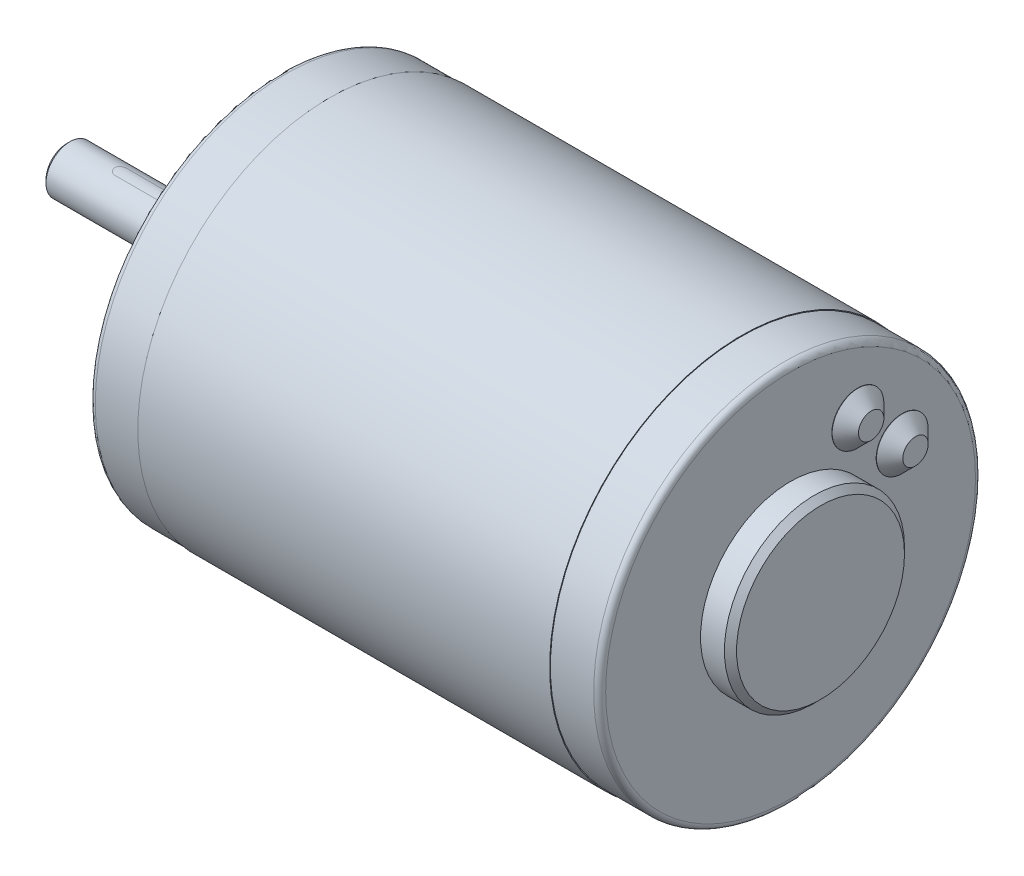
ISO-10303-21;
HEADER;
FILE_DESCRIPTION(('STEP AP214'),'2;1');
FILE_NAME('part.step','',(''),(''),'','','');
FILE_SCHEMA(('AUTOMOTIVE_DESIGN { 1 0 10303 214 1 1 1 1 }'));
ENDSEC;
DATA;
#1=APPLICATION_CONTEXT('core data for automotive mechanical design processes');
#2=APPLICATION_PROTOCOL_DEFINITION('international standard','automotive_design',2000,#1);
#3=PRODUCT_CONTEXT('',#1,'mechanical');
#4=PRODUCT('Part','Part','',(#3));
#5=PRODUCT_RELATED_PRODUCT_CATEGORY('part','',(#4));
#6=PRODUCT_DEFINITION_FORMATION('','',#4);
#7=PRODUCT_DEFINITION_CONTEXT('part definition',#1,'design');
#8=PRODUCT_DEFINITION('design','',#6,#7);
#9=PRODUCT_DEFINITION_SHAPE('','',#8);
#10=(LENGTH_UNIT() NAMED_UNIT(*) SI_UNIT(.MILLI.,.METRE.));
#11=(NAMED_UNIT(*) PLANE_ANGLE_UNIT() SI_UNIT($,.RADIAN.));
#12=(NAMED_UNIT(*) SI_UNIT($,.STERADIAN.) SOLID_ANGLE_UNIT());
#13=UNCERTAINTY_MEASURE_WITH_UNIT(LENGTH_MEASURE(1.E-05),#10,'distance_accuracy_value','');
#14=(GEOMETRIC_REPRESENTATION_CONTEXT(3) GLOBAL_UNCERTAINTY_ASSIGNED_CONTEXT((#13)) GLOBAL_UNIT_ASSIGNED_CONTEXT((#10,
#11,#12)) REPRESENTATION_CONTEXT('',''));
#15=CARTESIAN_POINT('',(0.,0.,0.));
#16=DIRECTION('',(0.,0.,1.));
#17=DIRECTION('',(1.,0.,0.));
#18=AXIS2_PLACEMENT_3D('',#15,#16,#17);
#19=CARTESIAN_POINT('',(-4.,0.,0.));
#20=DIRECTION('',(-1.,0.,0.));
#21=DIRECTION('',(0.,0.,1.));
#22=AXIS2_PLACEMENT_3D('',#19,#20,#21);
#23=PLANE('',#22);
#24=CARTESIAN_POINT('',(-4.,0.,0.));
#25=DIRECTION('',(-1.,0.,0.));
#26=DIRECTION('',(0.,0.,1.));
#27=AXIS2_PLACEMENT_3D('',#24,#25,#26);
#28=CIRCLE('',#27,8.50900000000003);
#29=CARTESIAN_POINT('',(-4.,0.,8.50900000000003));
#30=VERTEX_POINT('',#29);
#31=EDGE_CURVE('P0_E190',#30,#30,#28,.T.);
#32=ORIENTED_EDGE('',*,*,#31,.T.);
#33=EDGE_LOOP('',(#32));
#34=FACE_BOUND('',#33,.T.);
#35=CARTESIAN_POINT('',(-4.,0.,0.));
#36=DIRECTION('',(-1.,0.,0.));
#37=DIRECTION('',(0.,0.,1.));
#38=AXIS2_PLACEMENT_3D('',#35,#36,#37);
#39=CIRCLE('',#38,4.);
#40=CARTESIAN_POINT('',(-4.,0.,4.));
#41=VERTEX_POINT('',#40);
#42=EDGE_CURVE('P0_E122',#41,#41,#39,.T.);
#43=ORIENTED_EDGE('',*,*,#42,.F.);
#44=EDGE_LOOP('',(#43));
#45=FACE_BOUND('',#44,.T.);
#46=ADVANCED_FACE('P0_F39',(#34,#45),#23,.T.);
#47=CARTESIAN_POINT('',(0.,0.,0.));
#48=DIRECTION('',(-1.,0.,0.));
#49=DIRECTION('',(0.,0.,1.));
#50=AXIS2_PLACEMENT_3D('',#47,#48,#49);
#51=PLANE('',#50);
#52=CARTESIAN_POINT('',(0.,0.,0.));
#53=DIRECTION('',(-1.,0.,0.));
#54=DIRECTION('',(0.,0.,1.));
#55=AXIS2_PLACEMENT_3D('',#52,#53,#54);
#56=CIRCLE('',#55,30.877);
#57=CARTESIAN_POINT('',(0.,0.,30.877));
#58=VERTEX_POINT('',#57);
#59=EDGE_CURVE('P0_E208',#58,#58,#56,.T.);
#60=ORIENTED_EDGE('',*,*,#59,.T.);
#61=EDGE_LOOP('',(#60));
#62=FACE_BOUND('',#61,.T.);
#63=CARTESIAN_POINT('',(0.,25.4,0.));
#64=DIRECTION('',(-1.,0.,0.));
#65=DIRECTION('',(0.,0.,1.));
#66=AXIS2_PLACEMENT_3D('',#63,#64,#65);
#67=CIRCLE('',#66,2.01929999999999);
#68=CARTESIAN_POINT('',(0.,25.4,2.01929999999999));
#69=VERTEX_POINT('',#68);
#70=EDGE_CURVE('P0_E96',#69,#69,#67,.T.);
#71=ORIENTED_EDGE('',*,*,#70,.F.);
#72=EDGE_LOOP('',(#71));
#73=FACE_BOUND('',#72,.T.);
#74=CARTESIAN_POINT('',(0.,-25.4,0.));
#75=DIRECTION('',(-1.,0.,0.));
#76=DIRECTION('',(0.,0.,1.));
#77=AXIS2_PLACEMENT_3D('',#74,#75,#76);
#78=CIRCLE('',#77,2.01929999999999);
#79=CARTESIAN_POINT('',(0.,-25.4,2.01929999999999));
#80=VERTEX_POINT('',#79);
#81=EDGE_CURVE('P0_E95',#80,#80,#78,.T.);
#82=ORIENTED_EDGE('',*,*,#81,.F.);
#83=EDGE_LOOP('',(#82));
#84=FACE_BOUND('',#83,.T.);
#85=CARTESIAN_POINT('',(0.,0.,0.));
#86=DIRECTION('',(-1.,0.,0.));
#87=DIRECTION('',(0.,0.,1.));
#88=AXIS2_PLACEMENT_3D('',#85,#86,#87);
#89=CIRCLE('',#88,9.525);
#90=CARTESIAN_POINT('',(0.,0.,9.525));
#91=VERTEX_POINT('',#90);
#92=EDGE_CURVE('P0_E166',#91,#91,#89,.T.);
#93=ORIENTED_EDGE('',*,*,#92,.F.);
#94=EDGE_LOOP('',(#93));
#95=FACE_BOUND('',#94,.T.);
#96=ADVANCED_FACE('P0_F229',(#62,#73,#84,#95),#51,.T.);
#97=CARTESIAN_POINT('',(8.2296,32.004,0.));
#98=DIRECTION('',(-1.,0.,0.));
#99=DIRECTION('',(0.,0.,1.));
#100=AXIS2_PLACEMENT_3D('',#97,#98,#99);
#101=PLANE('',#100);
#102=CARTESIAN_POINT('',(8.2296,0.,0.));
#103=DIRECTION('',(1.,0.,0.));
#104=DIRECTION('',(0.,0.,-1.));
#105=AXIS2_PLACEMENT_3D('',#102,#103,#104);
#106=CIRCLE('',#105,32.004);
#107=CARTESIAN_POINT('',(8.2296,0.,-32.004));
#108=VERTEX_POINT('',#107);
#109=EDGE_CURVE('P0_E181',#108,#108,#106,.T.);
#110=ORIENTED_EDGE('',*,*,#109,.F.);
#111=EDGE_LOOP('',(#110));
#112=FACE_BOUND('',#111,.T.);
#113=CARTESIAN_POINT('',(8.2296,0.,0.));
#114=DIRECTION('',(-1.,0.,0.));
#115=DIRECTION('',(0.,0.,1.));
#116=AXIS2_PLACEMENT_3D('',#113,#114,#115);
#117=CIRCLE('',#116,31.877);
#118=CARTESIAN_POINT('',(8.2296,0.,31.877));
#119=VERTEX_POINT('',#118);
#120=EDGE_CURVE('P0_E169',#119,#119,#117,.T.);
#121=ORIENTED_EDGE('',*,*,#120,.F.);
#122=EDGE_LOOP('',(#121));
#123=FACE_BOUND('',#122,.T.);
#124=ADVANCED_FACE('P0_F235',(#112,#123),#101,.T.);
#125=CARTESIAN_POINT('',(85.216,0.,0.));
#126=DIRECTION('',(1.,0.,0.));
#127=DIRECTION('',(0.,0.,-1.));
#128=AXIS2_PLACEMENT_3D('',#125,#126,#127);
#129=PLANE('',#128);
#130=CARTESIAN_POINT('',(85.216,0.,0.));
#131=DIRECTION('',(1.,0.,0.));
#132=DIRECTION('',(0.,0.,-1.));
#133=AXIS2_PLACEMENT_3D('',#130,#131,#132);
#134=CIRCLE('',#133,30.877);
#135=CARTESIAN_POINT('',(85.216,0.,-30.877));
#136=VERTEX_POINT('',#135);
#137=EDGE_CURVE('P0_E47',#136,#136,#134,.T.);
#138=ORIENTED_EDGE('',*,*,#137,.T.);
#139=EDGE_LOOP('',(#138));
#140=FACE_BOUND('',#139,.T.);
#141=CARTESIAN_POINT('',(85.216,18.6070906828553,-11.2073596390943));
#142=DIRECTION('',(1.,0.,0.));
#143=DIRECTION('',(0.,0.,-1.));
#144=AXIS2_PLACEMENT_3D('',#141,#142,#143);
#145=CIRCLE('',#144,4.318);
#146=CARTESIAN_POINT('',(85.216,18.6070906828553,-15.5253596390943));
#147=VERTEX_POINT('',#146);
#148=EDGE_CURVE('P0_E187',#147,#147,#145,.T.);
#149=ORIENTED_EDGE('',*,*,#148,.F.);
#150=EDGE_LOOP('',(#149));
#151=FACE_BOUND('',#150,.T.);
#152=CARTESIAN_POINT('',(85.216,11.2073596390943,-18.6070906828553));
#153=DIRECTION('',(1.,0.,0.));
#154=DIRECTION('',(0.,0.,-1.));
#155=AXIS2_PLACEMENT_3D('',#152,#153,#154);
#156=CIRCLE('',#155,4.318);
#157=CARTESIAN_POINT('',(85.216,11.2073596390943,-22.9250906828553));
#158=VERTEX_POINT('',#157);
#159=EDGE_CURVE('P0_E184',#158,#158,#156,.T.);
#160=ORIENTED_EDGE('',*,*,#159,.F.);
#161=EDGE_LOOP('',(#160));
#162=FACE_BOUND('',#161,.T.);
#163=CARTESIAN_POINT('',(85.216,0.,0.));
#164=DIRECTION('',(1.,0.,0.));
#165=DIRECTION('',(0.,0.,-1.));
#166=AXIS2_PLACEMENT_3D('',#163,#164,#165);
#167=CIRCLE('',#166,15.0368);
#168=CARTESIAN_POINT('',(85.216,0.,-15.0368));
#169=VERTEX_POINT('',#168);
#170=EDGE_CURVE('P0_E172',#169,#169,#167,.T.);
#171=ORIENTED_EDGE('',*,*,#170,.F.);
#172=EDGE_LOOP('',(#171));
#173=FACE_BOUND('',#172,.T.);
#174=ADVANCED_FACE('P0_F216',(#140,#151,#162,#173),#129,.T.);
#175=CARTESIAN_POINT('',(76.9864,0.,0.));
#176=DIRECTION('',(1.,0.,0.));
#177=DIRECTION('',(0.,0.,-1.));
#178=AXIS2_PLACEMENT_3D('',#175,#176,#177);
#179=PLANE('',#178);
#180=CARTESIAN_POINT('',(76.9864,0.,0.));
#181=DIRECTION('',(1.,0.,0.));
#182=DIRECTION('',(0.,0.,-1.));
#183=AXIS2_PLACEMENT_3D('',#180,#181,#182);
#184=CIRCLE('',#183,32.004);
#185=CARTESIAN_POINT('',(76.9864,0.,-32.004));
#186=VERTEX_POINT('',#185);
#187=EDGE_CURVE('P0_E178',#186,#186,#184,.T.);
#188=ORIENTED_EDGE('',*,*,#187,.T.);
#189=EDGE_LOOP('',(#188));
#190=FACE_BOUND('',#189,.T.);
#191=CARTESIAN_POINT('',(76.9864,0.,0.));
#192=DIRECTION('',(1.,0.,0.));
#193=DIRECTION('',(0.,0.,-1.));
#194=AXIS2_PLACEMENT_3D('',#191,#192,#193);
#195=CIRCLE('',#194,31.877);
#196=CARTESIAN_POINT('',(76.9864,0.,-31.877));
#197=VERTEX_POINT('',#196);
#198=EDGE_CURVE('P0_E175',#197,#197,#195,.T.);
#199=ORIENTED_EDGE('',*,*,#198,.F.);
#200=EDGE_LOOP('',(#199));
#201=FACE_BOUND('',#200,.T.);
#202=ADVANCED_FACE('P0_F262',(#190,#201),#179,.T.);
#203=CARTESIAN_POINT('',(8.2296,0.,0.));
#204=DIRECTION('',(1.,0.,0.));
#205=DIRECTION('',(0.,0.,-1.));
#206=AXIS2_PLACEMENT_3D('',#203,#204,#205);
#207=CYLINDRICAL_SURFACE('',#206,32.004);
#208=ORIENTED_EDGE('',*,*,#109,.T.);
#209=EDGE_LOOP('',(#208));
#210=FACE_BOUND('',#209,.T.);
#211=ORIENTED_EDGE('',*,*,#187,.F.);
#212=EDGE_LOOP('',(#211));
#213=FACE_BOUND('',#212,.T.);
#214=ADVANCED_FACE('P0_F265',(#210,#213),#207,.T.);
#215=CARTESIAN_POINT('',(85.216,0.,0.));
#216=DIRECTION('',(-1.,0.,0.));
#217=DIRECTION('',(0.,0.,1.));
#218=AXIS2_PLACEMENT_3D('',#215,#216,#217);
#219=CYLINDRICAL_SURFACE('',#218,31.877);
#220=CARTESIAN_POINT('',(84.216,0.,0.));
#221=DIRECTION('',(1.,0.,0.));
#222=DIRECTION('',(0.,0.,-1.));
#223=AXIS2_PLACEMENT_3D('',#220,#221,#222);
#224=CIRCLE('',#223,31.877);
#225=CARTESIAN_POINT('',(84.216,0.,-31.877));
#226=VERTEX_POINT('',#225);
#227=EDGE_CURVE('P0_E11',#226,#226,#224,.F.);
#228=ORIENTED_EDGE('',*,*,#227,.T.);
#229=EDGE_LOOP('',(#228));
#230=FACE_BOUND('',#229,.T.);
#231=ORIENTED_EDGE('',*,*,#198,.T.);
#232=EDGE_LOOP('',(#231));
#233=FACE_BOUND('',#232,.T.);
#234=ADVANCED_FACE('P0_F258',(#230,#233),#219,.T.);
#235=CARTESIAN_POINT('',(90.216,0.,0.));
#236=DIRECTION('',(-1.,0.,0.));
#237=DIRECTION('',(0.,0.,1.));
#238=AXIS2_PLACEMENT_3D('',#235,#236,#237);
#239=CYLINDRICAL_SURFACE('',#238,15.0368);
#240=CARTESIAN_POINT('',(89.2,0.,0.));
#241=DIRECTION('',(1.,0.,0.));
#242=DIRECTION('',(0.,0.,-1.));
#243=AXIS2_PLACEMENT_3D('',#240,#241,#242);
#244=CIRCLE('',#243,15.0368);
#245=CARTESIAN_POINT('',(89.2,0.,-15.0368));
#246=VERTEX_POINT('',#245);
#247=EDGE_CURVE('P0_E199',#246,#246,#244,.F.);
#248=ORIENTED_EDGE('',*,*,#247,.T.);
#249=EDGE_LOOP('',(#248));
#250=FACE_BOUND('',#249,.T.);
#251=ORIENTED_EDGE('',*,*,#170,.T.);
#252=EDGE_LOOP('',(#251));
#253=FACE_BOUND('',#252,.T.);
#254=ADVANCED_FACE('P0_F254',(#250,#253),#239,.T.);
#255=CARTESIAN_POINT('',(90.216,0.,0.));
#256=DIRECTION('',(1.,0.,0.));
#257=DIRECTION('',(0.,0.,-1.));
#258=AXIS2_PLACEMENT_3D('',#255,#256,#257);
#259=PLANE('',#258);
#260=CARTESIAN_POINT('',(90.216,0.,0.));
#261=DIRECTION('',(1.,0.,0.));
#262=DIRECTION('',(0.,0.,-1.));
#263=AXIS2_PLACEMENT_3D('',#260,#261,#262);
#264=CIRCLE('',#263,14.0208);
#265=CARTESIAN_POINT('',(90.216,0.,-14.0208));
#266=VERTEX_POINT('',#265);
#267=EDGE_CURVE('P0_E196',#266,#266,#264,.T.);
#268=ORIENTED_EDGE('',*,*,#267,.T.);
#269=EDGE_LOOP('',(#268));
#270=FACE_BOUND('',#269,.T.);
#271=ADVANCED_FACE('P0_F250',(#270),#259,.T.);
#272=CARTESIAN_POINT('',(0.,0.,0.));
#273=DIRECTION('',(1.,0.,0.));
#274=DIRECTION('',(0.,0.,-1.));
#275=AXIS2_PLACEMENT_3D('',#272,#273,#274);
#276=CYLINDRICAL_SURFACE('',#275,31.877);
#277=CARTESIAN_POINT('',(0.999999999999997,0.,0.));
#278=DIRECTION('',(-1.,0.,0.));
#279=DIRECTION('',(0.,0.,1.));
#280=AXIS2_PLACEMENT_3D('',#277,#278,#279);
#281=CIRCLE('',#280,31.877);
#282=CARTESIAN_POINT('',(0.999999999999997,0.,31.877));
#283=VERTEX_POINT('',#282);
#284=EDGE_CURVE('P0_E211',#283,#283,#281,.F.);
#285=ORIENTED_EDGE('',*,*,#284,.T.);
#286=EDGE_LOOP('',(#285));
#287=FACE_BOUND('',#286,.T.);
#288=ORIENTED_EDGE('',*,*,#120,.T.);
#289=EDGE_LOOP('',(#288));
#290=FACE_BOUND('',#289,.T.);
#291=ADVANCED_FACE('P0_F245',(#287,#290),#276,.T.);
#292=CARTESIAN_POINT('',(-4.,0.,0.));
#293=DIRECTION('',(1.,0.,0.));
#294=DIRECTION('',(0.,0.,-1.));
#295=AXIS2_PLACEMENT_3D('',#292,#293,#294);
#296=CYLINDRICAL_SURFACE('',#295,9.525);
#297=CARTESIAN_POINT('',(-2.98400000000003,0.,0.));
#298=DIRECTION('',(-1.,0.,0.));
#299=DIRECTION('',(0.,0.,1.));
#300=AXIS2_PLACEMENT_3D('',#297,#298,#299);
#301=CIRCLE('',#300,9.525);
#302=CARTESIAN_POINT('',(-2.98400000000003,0.,9.525));
#303=VERTEX_POINT('',#302);
#304=EDGE_CURVE('P0_E193',#303,#303,#301,.F.);
#305=ORIENTED_EDGE('',*,*,#304,.T.);
#306=EDGE_LOOP('',(#305));
#307=FACE_BOUND('',#306,.T.);
#308=ORIENTED_EDGE('',*,*,#92,.T.);
#309=EDGE_LOOP('',(#308));
#310=FACE_BOUND('',#309,.T.);
#311=ADVANCED_FACE('P0_F243',(#307,#310),#296,.T.);
#312=CARTESIAN_POINT('',(-35.6,0.,0.));
#313=DIRECTION('',(1.,0.,0.));
#314=DIRECTION('',(0.,0.,-1.));
#315=AXIS2_PLACEMENT_3D('',#312,#313,#314);
#316=CYLINDRICAL_SURFACE('',#315,4.);
#317=CARTESIAN_POINT('',(-35.0999999999929,0.,0.));
#318=DIRECTION('',(-1.,0.,0.));
#319=DIRECTION('',(0.,0.,1.));
#320=AXIS2_PLACEMENT_3D('',#317,#318,#319);
#321=CIRCLE('',#320,4.);
#322=CARTESIAN_POINT('',(-35.0999999999929,0.,4.));
#323=VERTEX_POINT('',#322);
#324=EDGE_CURVE('P0_E205',#323,#323,#321,.F.);
#325=ORIENTED_EDGE('',*,*,#324,.T.);
#326=EDGE_LOOP('',(#325));
#327=FACE_BOUND('',#326,.T.);
#328=DIRECTION('',(1.,0.,0.));
#329=VECTOR('',#328,1.);
#330=CARTESIAN_POINT('',(0.,3.87298334620741,-1.));
#331=LINE('',#330,#329);
#332=CARTESIAN_POINT('',(-26.6,3.87298334620741,-1.));
#333=VERTEX_POINT('',#332);
#334=CARTESIAN_POINT('',(-7.1,3.87298334620741,-1.));
#335=VERTEX_POINT('',#334);
#336=EDGE_CURVE('P0_E141',#333,#335,#331,.T.);
#337=ORIENTED_EDGE('',*,*,#336,.T.);
#338=CARTESIAN_POINT('',(-7.1,3.87298334620741,-1.));
#339=CARTESIAN_POINT('',(-7.07233701489346,3.87298148580177,-1.00000033749611));
#340=CARTESIAN_POINT('',(-7.04468773698177,3.8732800994947,-0.998851407375366));
#341=CARTESIAN_POINT('',(-6.98959596469644,3.87445904774558,-0.994271295395754));
#342=CARTESIAN_POINT('',(-6.96215343631291,3.87533928441687,-0.990840497572679));
#343=CARTESIAN_POINT('',(-6.88054682679116,3.87881710972053,-0.977175239382526));
#344=CARTESIAN_POINT('',(-6.82694353151779,3.88225203148808,-0.963567695172493));
#345=CARTESIAN_POINT('',(-6.72287532621804,3.89095422588002,-0.927798076247997));
#346=CARTESIAN_POINT('',(-6.67241012178714,3.89622132630929,-0.905636805423836));
#347=CARTESIAN_POINT('',(-6.57588855135267,3.90799134471939,-0.853415378025865));
#348=CARTESIAN_POINT('',(-6.52983337210904,3.91449459395647,-0.823353103356933));
#349=CARTESIAN_POINT('',(-6.4424561180939,3.92816262398025,-0.755484471828069));
#350=CARTESIAN_POINT('',(-6.40124511375448,3.93533791028915,-0.717537268783976));
#351=CARTESIAN_POINT('',(-6.32569791051729,3.94945104396193,-0.63527578051623));
#352=CARTESIAN_POINT('',(-6.29136281053206,3.95638885322537,-0.590960479478831));
#353=CARTESIAN_POINT('',(-6.23008899838136,3.96936182283248,-0.496456899401691));
#354=CARTESIAN_POINT('',(-6.20326010401603,3.9753830468173,-0.446195340334474));
#355=CARTESIAN_POINT('',(-6.1584752658033,3.98572346250588,-0.341702590842919));
#356=CARTESIAN_POINT('',(-6.14051757570017,3.990042989147,-0.28747218408301));
#357=CARTESIAN_POINT('',(-6.11434100722257,3.99641900005128,-0.17774410852516));
#358=CARTESIAN_POINT('',(-6.10593232757718,3.998519529013,-0.122294322002858));
#359=CARTESIAN_POINT('',(-6.09849662845671,4.00037438150815,-0.0107327756816796));
#360=CARTESIAN_POINT('',(-6.09946842980766,4.00012899993444,0.0453789000287057));
#361=CARTESIAN_POINT('',(-6.11062996368545,3.99735237365735,0.155352492972096));
#362=CARTESIAN_POINT('',(-6.12061461659948,3.9948719867736,0.209236701739855));
#363=CARTESIAN_POINT('',(-6.14918867918275,3.98796330636495,0.31453871108434));
#364=CARTESIAN_POINT('',(-6.16777846956858,3.98353492665556,0.365956402423988));
#365=CARTESIAN_POINT('',(-6.21320128067065,3.97314997761798,0.465407286024539));
#366=CARTESIAN_POINT('',(-6.24010739423284,3.96717993827555,0.513405629602248));
#367=CARTESIAN_POINT('',(-6.30134312983347,3.95435945541919,0.604276631230014));
#368=CARTESIAN_POINT('',(-6.33567387025322,3.94750887933198,0.647148515562289));
#369=CARTESIAN_POINT('',(-6.41187891208131,3.93345566022865,0.72776938970849));
#370=CARTESIAN_POINT('',(-6.45393163653981,3.92624850477685,0.765349103054127));
#371=CARTESIAN_POINT('',(-6.54382986692773,3.91246168284006,0.832969575186237));
#372=CARTESIAN_POINT('',(-6.59167695328356,3.90588218842993,0.863008270245062));
#373=CARTESIAN_POINT('',(-6.69214559782377,3.89407813586325,0.914804709285962));
#374=CARTESIAN_POINT('',(-6.74479146489609,3.88886106009136,0.936517017887269));
#375=CARTESIAN_POINT('',(-6.85311692841829,3.88047058807055,0.970702351849829));
#376=CARTESIAN_POINT('',(-6.90879185514984,3.87729413761435,0.983189189212132));
#377=CARTESIAN_POINT('',(-6.9874573807589,3.87455290681524,0.993904635150938));
#378=CARTESIAN_POINT('',(-7.00991970321318,3.87396523110859,0.996190790966708));
#379=CARTESIAN_POINT('',(-7.05491778990932,3.87318062488974,0.999236757697394));
#380=CARTESIAN_POINT('',(-7.07745337595529,3.87298306219461,0.999999038096045));
#381=CARTESIAN_POINT('',(-7.1,3.87298334620741,1.));
#382=B_SPLINE_CURVE_WITH_KNOTS('',3,(#338,#339,#340,#341,#342,#343,#344,#345,#346,#347,#348,
#349,#350,#351,#352,#353,#354,#355,#356,#357,#358,#359,#360,#361,#362,#363,#364,#365,#366,#367,
#368,#369,#370,#371,#372,#373,#374,#375,#376,#377,#378,#379,#380,#381),.UNSPECIFIED.,.F.,.F.,(4,
2,2,2,2,2,2,2,2,2,2,2,2,2,2,2,2,2,2,2,2,4),(0.,0.0829365303397693,0.165859106084651,
0.331229963080317,0.496585282091498,0.661984974726749,0.830641897427974,0.999325753539193,
1.17036187098235,1.34136430732424,1.50890481515325,1.67642426256639,1.84022545479276,
2.00403389475838,2.16932509450376,2.33464120964329,2.50441429534542,2.67423379180967,
2.84496720161068,3.01544447539986,3.08315848722648,3.15076267731671),.UNSPECIFIED.);
#383=CARTESIAN_POINT('',(-7.1,3.87298334620741,1.));
#384=VERTEX_POINT('',#383);
#385=EDGE_CURVE('P0_E118',#335,#384,#382,.T.);
#386=ORIENTED_EDGE('',*,*,#385,.T.);
#387=DIRECTION('',(1.,0.,0.));
#388=VECTOR('',#387,1.);
#389=CARTESIAN_POINT('',(0.,3.87298334620741,1.));
#390=LINE('',#389,#388);
#391=CARTESIAN_POINT('',(-26.6,3.87298334620741,1.));
#392=VERTEX_POINT('',#391);
#393=EDGE_CURVE('P0_E156',#384,#392,#390,.F.);
#394=ORIENTED_EDGE('',*,*,#393,.T.);
#395=CARTESIAN_POINT('',(-26.6,3.87298334620741,1.));
#396=CARTESIAN_POINT('',(-26.6276629851065,3.87298148580177,1.00000033749611));
#397=CARTESIAN_POINT('',(-26.6553122630182,3.8732800994947,0.998851407375366));
#398=CARTESIAN_POINT('',(-26.7104040353036,3.87445904774558,0.994271295395754));
#399=CARTESIAN_POINT('',(-26.7378465636871,3.87533928441687,0.990840497572679));
#400=CARTESIAN_POINT('',(-26.8194531732088,3.87881710972053,0.977175239382526));
#401=CARTESIAN_POINT('',(-26.8730564684822,3.88225203148808,0.963567695172493));
#402=CARTESIAN_POINT('',(-26.977124673782,3.89095422588002,0.927798076247996));
#403=CARTESIAN_POINT('',(-27.0275898782129,3.89622132630929,0.905636805423835));
#404=CARTESIAN_POINT('',(-27.1241114486473,3.90799134471939,0.853415378025864));
#405=CARTESIAN_POINT('',(-27.170166627891,3.91449459395647,0.823353103356932));
#406=CARTESIAN_POINT('',(-27.2575438819061,3.92816262398025,0.755484471828069));
#407=CARTESIAN_POINT('',(-27.2987548862455,3.93533791028915,0.717537268783975));
#408=CARTESIAN_POINT('',(-27.3743020894827,3.94945104396193,0.635275780516229));
#409=CARTESIAN_POINT('',(-27.4086371894679,3.95638885322537,0.59096047947883));
#410=CARTESIAN_POINT('',(-27.4699110016186,3.96936182283248,0.496456899401689));
#411=CARTESIAN_POINT('',(-27.496739895984,3.9753830468173,0.446195340334472));
#412=CARTESIAN_POINT('',(-27.5415247341967,3.98572346250588,0.341702590842916));
#413=CARTESIAN_POINT('',(-27.5594824242998,3.990042989147,0.287472184083007));
#414=CARTESIAN_POINT('',(-27.5856589927774,3.99641900005128,0.177744108525158));
#415=CARTESIAN_POINT('',(-27.5940676724228,3.998519529013,0.122294322002856));
#416=CARTESIAN_POINT('',(-27.6015033715433,4.00037438150815,0.0107327756816781));
#417=CARTESIAN_POINT('',(-27.6005315701923,4.00012899993444,-0.0453789000287067));
#418=CARTESIAN_POINT('',(-27.5893700363146,3.99735237365735,-0.155352492972096));
#419=CARTESIAN_POINT('',(-27.5793853834005,3.9948719867736,-0.209236701739855));
#420=CARTESIAN_POINT('',(-27.5508113208173,3.98796330636495,-0.31453871108434));
#421=CARTESIAN_POINT('',(-27.5322215304314,3.98353492665556,-0.365956402423988));
#422=CARTESIAN_POINT('',(-27.4867987193294,3.97314997761798,-0.46540728602454));
#423=CARTESIAN_POINT('',(-27.4598926057672,3.96717993827555,-0.513405629602248));
#424=CARTESIAN_POINT('',(-27.3986568701665,3.95435945541919,-0.604276631230015));
#425=CARTESIAN_POINT('',(-27.3643261297468,3.94750887933198,-0.64714851556229));
#426=CARTESIAN_POINT('',(-27.2881210879187,3.93345566022865,-0.727769389708492));
#427=CARTESIAN_POINT('',(-27.2460683634602,3.92624850477685,-0.765349103054128));
#428=CARTESIAN_POINT('',(-27.1561701330723,3.91246168284006,-0.832969575186237));
#429=CARTESIAN_POINT('',(-27.1083230467164,3.90588218842993,-0.863008270245062));
#430=CARTESIAN_POINT('',(-27.0078544021762,3.89407813586325,-0.914804709285961));
#431=CARTESIAN_POINT('',(-26.9552085351039,3.88886106009136,-0.936517017887269));
#432=CARTESIAN_POINT('',(-26.8468830715817,3.88047058807054,-0.970702351849828));
#433=CARTESIAN_POINT('',(-26.7912081448502,3.87729413761435,-0.983189189212131));
#434=CARTESIAN_POINT('',(-26.7125426192411,3.87455290681524,-0.993904635150938));
#435=CARTESIAN_POINT('',(-26.6900802967868,3.87396523110859,-0.996190790966708));
#436=CARTESIAN_POINT('',(-26.6450822100907,3.87318062488974,-0.999236757697394));
#437=CARTESIAN_POINT('',(-26.6225466240447,3.87298306219461,-0.999999038096045));
#438=CARTESIAN_POINT('',(-26.6,3.87298334620741,-1.));
#439=B_SPLINE_CURVE_WITH_KNOTS('',3,(#395,#396,#397,#398,#399,#400,#401,#402,#403,#404,#405,
#406,#407,#408,#409,#410,#411,#412,#413,#414,#415,#416,#417,#418,#419,#420,#421,#422,#423,#424,
#425,#426,#427,#428,#429,#430,#431,#432,#433,#434,#435,#436,#437,#438),.UNSPECIFIED.,.F.,.F.,(4,
2,2,2,2,2,2,2,2,2,2,2,2,2,2,2,2,2,2,2,2,4),(0.,0.0829365303397727,0.165859106084653,
0.331229963080318,0.496585282091499,0.661984974726751,0.830641897427976,0.999325753539196,
1.17036187098235,1.34136430732425,1.50890481515325,1.67642426256639,1.84022545479276,
2.00403389475838,2.16932509450376,2.33464120964329,2.50441429534542,2.67423379180967,
2.84496720161068,3.01544447539986,3.08315848722649,3.15076267731671),.UNSPECIFIED.);
#440=EDGE_CURVE('P0_E54',#392,#333,#439,.T.);
#441=ORIENTED_EDGE('',*,*,#440,.T.);
#442=EDGE_LOOP('',(#337,#386,#394,#441));
#443=FACE_BOUND('',#442,.T.);
#444=ORIENTED_EDGE('',*,*,#42,.T.);
#445=EDGE_LOOP('',(#444));
#446=FACE_BOUND('',#445,.T.);
#447=ADVANCED_FACE('P0_F241',(#327,#443,#446),#316,.T.);
#448=CARTESIAN_POINT('',(-35.6,0.,0.));
#449=DIRECTION('',(-1.,0.,0.));
#450=DIRECTION('',(0.,0.,1.));
#451=AXIS2_PLACEMENT_3D('',#448,#449,#450);
#452=PLANE('',#451);
#453=CARTESIAN_POINT('',(-35.6,0.,0.));
#454=DIRECTION('',(-1.,0.,0.));
#455=DIRECTION('',(0.,0.,1.));
#456=AXIS2_PLACEMENT_3D('',#453,#454,#455);
#457=CIRCLE('',#456,3.4999999999361);
#458=CARTESIAN_POINT('',(-35.6,0.,3.4999999999361));
#459=VERTEX_POINT('',#458);
#460=EDGE_CURVE('P0_E202',#459,#459,#457,.T.);
#461=ORIENTED_EDGE('',*,*,#460,.T.);
#462=EDGE_LOOP('',(#461));
#463=FACE_BOUND('',#462,.T.);
#464=ADVANCED_FACE('P0_F292',(#463),#452,.T.);
#465=CARTESIAN_POINT('',(-7.1,32.005,0.));
#466=DIRECTION('',(0.,-1.,0.));
#467=DIRECTION('',(0.,0.,-1.));
#468=AXIS2_PLACEMENT_3D('',#465,#466,#467);
#469=CYLINDRICAL_SURFACE('',#468,1.);
#470=ORIENTED_EDGE('',*,*,#385,.F.);
#471=DIRECTION('',(0.,-1.,0.));
#472=VECTOR('',#471,1.);
#473=CARTESIAN_POINT('',(-7.1,32.005,-1.));
#474=LINE('',#473,#472);
#475=CARTESIAN_POINT('',(-7.1,2.79999999999999,-1.));
#476=VERTEX_POINT('',#475);
#477=EDGE_CURVE('P0_E140',#335,#476,#474,.T.);
#478=ORIENTED_EDGE('',*,*,#477,.T.);
#479=CARTESIAN_POINT('',(-7.1,2.79999999999999,0.));
#480=DIRECTION('',(0.,-1.,0.));
#481=DIRECTION('',(0.,0.,-1.));
#482=AXIS2_PLACEMENT_3D('',#479,#480,#481);
#483=CIRCLE('',#482,1.);
#484=CARTESIAN_POINT('',(-7.1,2.79999999999999,1.));
#485=VERTEX_POINT('',#484);
#486=EDGE_CURVE('P0_E129',#476,#485,#483,.T.);
#487=ORIENTED_EDGE('',*,*,#486,.T.);
#488=DIRECTION('',(0.,-1.,0.));
#489=VECTOR('',#488,1.);
#490=CARTESIAN_POINT('',(-7.1,32.005,1.));
#491=LINE('',#490,#489);
#492=EDGE_CURVE('P0_E62',#384,#485,#491,.T.);
#493=ORIENTED_EDGE('',*,*,#492,.F.);
#494=EDGE_LOOP('',(#470,#478,#487,#493));
#495=FACE_BOUND('',#494,.T.);
#496=ADVANCED_FACE('P0_F294',(#495),#469,.F.);
#497=CARTESIAN_POINT('',(-26.6,32.005,-1.));
#498=DIRECTION('',(0.,0.,-1.));
#499=DIRECTION('',(-1.,0.,0.));
#500=AXIS2_PLACEMENT_3D('',#497,#498,#499);
#501=PLANE('',#500);
#502=ORIENTED_EDGE('',*,*,#336,.F.);
#503=DIRECTION('',(0.,-1.,0.));
#504=VECTOR('',#503,1.);
#505=CARTESIAN_POINT('',(-26.6,32.005,-1.));
#506=LINE('',#505,#504);
#507=CARTESIAN_POINT('',(-26.6,2.79999999999999,-1.));
#508=VERTEX_POINT('',#507);
#509=EDGE_CURVE('P0_E139',#333,#508,#506,.T.);
#510=ORIENTED_EDGE('',*,*,#509,.T.);
#511=DIRECTION('',(1.,0.,0.));
#512=VECTOR('',#511,1.);
#513=CARTESIAN_POINT('',(-26.6,2.79999999999999,-1.));
#514=LINE('',#513,#512);
#515=EDGE_CURVE('P0_E119',#508,#476,#514,.T.);
#516=ORIENTED_EDGE('',*,*,#515,.T.);
#517=ORIENTED_EDGE('',*,*,#477,.F.);
#518=EDGE_LOOP('',(#502,#510,#516,#517));
#519=FACE_BOUND('',#518,.T.);
#520=ADVANCED_FACE('P0_F299',(#519),#501,.F.);
#521=CARTESIAN_POINT('',(-26.6,32.005,0.));
#522=DIRECTION('',(0.,-1.,0.));
#523=DIRECTION('',(0.,0.,-1.));
#524=AXIS2_PLACEMENT_3D('',#521,#522,#523);
#525=CYLINDRICAL_SURFACE('',#524,1.);
#526=ORIENTED_EDGE('',*,*,#440,.F.);
#527=DIRECTION('',(0.,-1.,0.));
#528=VECTOR('',#527,1.);
#529=CARTESIAN_POINT('',(-26.6,32.005,1.));
#530=LINE('',#529,#528);
#531=CARTESIAN_POINT('',(-26.6,2.79999999999999,1.));
#532=VERTEX_POINT('',#531);
#533=EDGE_CURVE('P0_E131',#392,#532,#530,.T.);
#534=ORIENTED_EDGE('',*,*,#533,.T.);
#535=CARTESIAN_POINT('',(-26.6,2.79999999999999,0.));
#536=DIRECTION('',(0.,-1.,0.));
#537=DIRECTION('',(0.,0.,-1.));
#538=AXIS2_PLACEMENT_3D('',#535,#536,#537);
#539=CIRCLE('',#538,1.);
#540=EDGE_CURVE('P0_E123',#532,#508,#539,.T.);
#541=ORIENTED_EDGE('',*,*,#540,.T.);
#542=ORIENTED_EDGE('',*,*,#509,.F.);
#543=EDGE_LOOP('',(#526,#534,#541,#542));
#544=FACE_BOUND('',#543,.T.);
#545=ADVANCED_FACE('P0_F305',(#544),#525,.F.);
#546=CARTESIAN_POINT('',(-7.1,32.005,1.));
#547=DIRECTION('',(0.,0.,1.));
#548=DIRECTION('',(1.,0.,0.));
#549=AXIS2_PLACEMENT_3D('',#546,#547,#548);
#550=PLANE('',#549);
#551=ORIENTED_EDGE('',*,*,#393,.F.);
#552=ORIENTED_EDGE('',*,*,#492,.T.);
#553=DIRECTION('',(-1.,0.,0.));
#554=VECTOR('',#553,1.);
#555=CARTESIAN_POINT('',(-7.1,2.79999999999999,1.));
#556=LINE('',#555,#554);
#557=EDGE_CURVE('P0_E126',#485,#532,#556,.T.);
#558=ORIENTED_EDGE('',*,*,#557,.T.);
#559=ORIENTED_EDGE('',*,*,#533,.F.);
#560=EDGE_LOOP('',(#551,#552,#558,#559));
#561=FACE_BOUND('',#560,.T.);
#562=ADVANCED_FACE('P0_F308',(#561),#550,.F.);
#563=CARTESIAN_POINT('',(-7.1,2.79999999999999,0.));
#564=DIRECTION('',(0.,-1.,0.));
#565=DIRECTION('',(0.,0.,-1.));
#566=AXIS2_PLACEMENT_3D('',#563,#564,#565);
#567=PLANE('',#566);
#568=ORIENTED_EDGE('',*,*,#486,.F.);
#569=ORIENTED_EDGE('',*,*,#515,.F.);
#570=ORIENTED_EDGE('',*,*,#540,.F.);
#571=ORIENTED_EDGE('',*,*,#557,.F.);
#572=EDGE_LOOP('',(#568,#569,#570,#571));
#573=FACE_BOUND('',#572,.T.);
#574=ADVANCED_FACE('P0_F310',(#573),#567,.F.);
#575=CARTESIAN_POINT('',(85.216,11.2073596390943,-18.6070906828553));
#576=DIRECTION('',(1.,0.,0.));
#577=DIRECTION('',(0.,0.,-1.));
#578=AXIS2_PLACEMENT_3D('',#575,#576,#577);
#579=CYLINDRICAL_SURFACE('',#578,4.318);
#580=ORIENTED_EDGE('',*,*,#159,.T.);
#581=EDGE_LOOP('',(#580));
#582=FACE_BOUND('',#581,.T.);
#583=CARTESIAN_POINT('',(85.2639,11.2073596390943,-18.6070906828553));
#584=DIRECTION('',(1.,0.,0.));
#585=DIRECTION('',(0.,0.,-1.));
#586=AXIS2_PLACEMENT_3D('',#583,#584,#585);
#587=CIRCLE('',#586,4.318);
#588=CARTESIAN_POINT('',(85.2639,11.2073596390943,-22.9250906828553));
#589=VERTEX_POINT('',#588);
#590=EDGE_CURVE('P0_E112',#589,#589,#587,.T.);
#591=ORIENTED_EDGE('',*,*,#590,.F.);
#592=EDGE_LOOP('',(#591));
#593=FACE_BOUND('',#592,.T.);
#594=ADVANCED_FACE('P0_F315',(#582,#593),#579,.T.);
#595=CARTESIAN_POINT('',(87.4638999999649,11.2073596390943,-18.6070906828553));
#596=DIRECTION('',(1.,0.,0.));
#597=DIRECTION('',(0.,0.,-1.));
#598=AXIS2_PLACEMENT_3D('',#595,#596,#597);
#599=PLANE('',#598);
#600=CARTESIAN_POINT('',(87.4638999999649,11.2073596390943,-18.6070906828553));
#601=DIRECTION('',(1.,0.,0.));
#602=DIRECTION('',(0.,0.,-1.));
#603=AXIS2_PLACEMENT_3D('',#600,#601,#602);
#604=CIRCLE('',#603,2.11800000003506);
#605=CARTESIAN_POINT('',(87.4638999999649,11.2073596390943,-20.7250906828904));
#606=VERTEX_POINT('',#605);
#607=EDGE_CURVE('P0_E115',#606,#606,#604,.T.);
#608=ORIENTED_EDGE('',*,*,#607,.T.);
#609=EDGE_LOOP('',(#608));
#610=FACE_BOUND('',#609,.T.);
#611=ADVANCED_FACE('P0_F338',(#610),#599,.T.);
#612=CARTESIAN_POINT('',(87.4638999999649,11.2073596390943,-18.6070906828553));
#613=DIRECTION('',(-1.,0.,0.));
#614=DIRECTION('',(0.,0.,1.));
#615=AXIS2_PLACEMENT_3D('',#612,#613,#614);
#616=CONICAL_SURFACE('',#615,2.11800000003506,0.78539816339745);
#617=ORIENTED_EDGE('',*,*,#590,.T.);
#618=EDGE_LOOP('',(#617));
#619=FACE_BOUND('',#618,.T.);
#620=ORIENTED_EDGE('',*,*,#607,.F.);
#621=EDGE_LOOP('',(#620));
#622=FACE_BOUND('',#621,.T.);
#623=ADVANCED_FACE('P0_F344',(#619,#622),#616,.T.);
#624=CARTESIAN_POINT('',(85.216,18.6070906828553,-11.2073596390943));
#625=DIRECTION('',(1.,0.,0.));
#626=DIRECTION('',(0.,0.,-1.));
#627=AXIS2_PLACEMENT_3D('',#624,#625,#626);
#628=CYLINDRICAL_SURFACE('',#627,4.318);
#629=ORIENTED_EDGE('',*,*,#148,.T.);
#630=EDGE_LOOP('',(#629));
#631=FACE_BOUND('',#630,.T.);
#632=CARTESIAN_POINT('',(85.2639,18.6070906828553,-11.2073596390943));
#633=DIRECTION('',(1.,0.,0.));
#634=DIRECTION('',(0.,0.,-1.));
#635=AXIS2_PLACEMENT_3D('',#632,#633,#634);
#636=CIRCLE('',#635,4.318);
#637=CARTESIAN_POINT('',(85.2639,18.6070906828553,-15.5253596390943));
#638=VERTEX_POINT('',#637);
#639=EDGE_CURVE('P0_E106',#638,#638,#636,.T.);
#640=ORIENTED_EDGE('',*,*,#639,.F.);
#641=EDGE_LOOP('',(#640));
#642=FACE_BOUND('',#641,.T.);
#643=ADVANCED_FACE('P0_F348',(#631,#642),#628,.T.);
#644=CARTESIAN_POINT('',(87.4638999999503,18.6070906828553,-11.2073596390943));
#645=DIRECTION('',(1.,0.,0.));
#646=DIRECTION('',(0.,0.,-1.));
#647=AXIS2_PLACEMENT_3D('',#644,#645,#646);
#648=PLANE('',#647);
#649=CARTESIAN_POINT('',(87.4638999999503,18.6070906828553,-11.2073596390943));
#650=DIRECTION('',(1.,0.,0.));
#651=DIRECTION('',(0.,0.,-1.));
#652=AXIS2_PLACEMENT_3D('',#649,#650,#651);
#653=CIRCLE('',#652,2.11800000004973);
#654=CARTESIAN_POINT('',(87.4638999999503,18.6070906828553,-13.3253596391441));
#655=VERTEX_POINT('',#654);
#656=EDGE_CURVE('P0_E109',#655,#655,#653,.T.);
#657=ORIENTED_EDGE('',*,*,#656,.T.);
#658=EDGE_LOOP('',(#657));
#659=FACE_BOUND('',#658,.T.);
#660=ADVANCED_FACE('P0_F352',(#659),#648,.T.);
#661=CARTESIAN_POINT('',(87.4638999999503,18.6070906828553,-11.2073596390943));
#662=DIRECTION('',(-1.,0.,0.));
#663=DIRECTION('',(0.,0.,1.));
#664=AXIS2_PLACEMENT_3D('',#661,#662,#663);
#665=CONICAL_SURFACE('',#664,2.11800000004973,0.785398163397448);
#666=ORIENTED_EDGE('',*,*,#639,.T.);
#667=EDGE_LOOP('',(#666));
#668=FACE_BOUND('',#667,.T.);
#669=ORIENTED_EDGE('',*,*,#656,.F.);
#670=EDGE_LOOP('',(#669));
#671=FACE_BOUND('',#670,.T.);
#672=ADVANCED_FACE('P0_F356',(#668,#671),#665,.T.);
#673=CARTESIAN_POINT('',(13.6144,-25.4,0.));
#674=DIRECTION('',(-1.,0.,0.));
#675=DIRECTION('',(0.,0.,1.));
#676=AXIS2_PLACEMENT_3D('',#673,#674,#675);
#677=CONICAL_SURFACE('',#676,2.01929999999999,1.02974425867198);
#678=CARTESIAN_POINT('',(14.8277178480152,-25.4,0.));
#679=VERTEX_POINT('',#678);
#680=VERTEX_LOOP('',#679);
#681=FACE_BOUND('',#680,.T.);
#682=CARTESIAN_POINT('',(13.6144,-25.4,0.));
#683=DIRECTION('',(-1.,0.,0.));
#684=DIRECTION('',(0.,0.,1.));
#685=AXIS2_PLACEMENT_3D('',#682,#683,#684);
#686=CIRCLE('',#685,2.01929999999999);
#687=CARTESIAN_POINT('',(13.6144,-25.4,2.01929999999999));
#688=VERTEX_POINT('',#687);
#689=EDGE_CURVE('P0_E99',#688,#688,#686,.T.);
#690=ORIENTED_EDGE('',*,*,#689,.T.);
#691=EDGE_LOOP('',(#690));
#692=FACE_BOUND('',#691,.T.);
#693=ADVANCED_FACE('P0_F360',(#681,#692),#677,.F.);
#694=CARTESIAN_POINT('',(0.,-25.4,0.));
#695=DIRECTION('',(-1.,0.,0.));
#696=DIRECTION('',(0.,0.,1.));
#697=AXIS2_PLACEMENT_3D('',#694,#695,#696);
#698=CYLINDRICAL_SURFACE('',#697,2.01929999999999);
#699=ORIENTED_EDGE('',*,*,#689,.F.);
#700=EDGE_LOOP('',(#699));
#701=FACE_BOUND('',#700,.T.);
#702=ORIENTED_EDGE('',*,*,#81,.T.);
#703=EDGE_LOOP('',(#702));
#704=FACE_BOUND('',#703,.T.);
#705=ADVANCED_FACE('P0_F89',(#701,#704),#698,.F.);
#706=CARTESIAN_POINT('',(13.6144,25.4,0.));
#707=DIRECTION('',(-1.,0.,0.));
#708=DIRECTION('',(0.,0.,1.));
#709=AXIS2_PLACEMENT_3D('',#706,#707,#708);
#710=CONICAL_SURFACE('',#709,2.01929999999999,1.02974425867198);
#711=CARTESIAN_POINT('',(14.8277178480152,25.4,0.));
#712=VERTEX_POINT('',#711);
#713=VERTEX_LOOP('',#712);
#714=FACE_BOUND('',#713,.T.);
#715=CARTESIAN_POINT('',(13.6144,25.4,0.));
#716=DIRECTION('',(-1.,0.,0.));
#717=DIRECTION('',(0.,0.,1.));
#718=AXIS2_PLACEMENT_3D('',#715,#716,#717);
#719=CIRCLE('',#718,2.01929999999999);
#720=CARTESIAN_POINT('',(13.6144,25.4,2.01929999999999));
#721=VERTEX_POINT('',#720);
#722=EDGE_CURVE('P0_E93',#721,#721,#719,.T.);
#723=ORIENTED_EDGE('',*,*,#722,.T.);
#724=EDGE_LOOP('',(#723));
#725=FACE_BOUND('',#724,.T.);
#726=ADVANCED_FACE('P0_F85',(#714,#725),#710,.F.);
#727=CARTESIAN_POINT('',(0.,25.4,0.));
#728=DIRECTION('',(-1.,0.,0.));
#729=DIRECTION('',(0.,0.,1.));
#730=AXIS2_PLACEMENT_3D('',#727,#728,#729);
#731=CYLINDRICAL_SURFACE('',#730,2.01929999999999);
#732=ORIENTED_EDGE('',*,*,#722,.F.);
#733=EDGE_LOOP('',(#732));
#734=FACE_BOUND('',#733,.T.);
#735=ORIENTED_EDGE('',*,*,#70,.T.);
#736=EDGE_LOOP('',(#735));
#737=FACE_BOUND('',#736,.T.);
#738=ADVANCED_FACE('P0_F88',(#734,#737),#731,.F.);
#739=CARTESIAN_POINT('',(-4.,0.,0.));
#740=DIRECTION('',(1.,0.,0.));
#741=DIRECTION('',(0.,0.,-1.));
#742=AXIS2_PLACEMENT_3D('',#739,#740,#741);
#743=CONICAL_SURFACE('',#742,8.50900000000003,0.785398163397447);
#744=ORIENTED_EDGE('',*,*,#304,.F.);
#745=EDGE_LOOP('',(#744));
#746=FACE_BOUND('',#745,.T.);
#747=ORIENTED_EDGE('',*,*,#31,.F.);
#748=EDGE_LOOP('',(#747));
#749=FACE_BOUND('',#748,.T.);
#750=ADVANCED_FACE('P0_F276',(#746,#749),#743,.T.);
#751=CARTESIAN_POINT('',(90.216,0.,0.));
#752=DIRECTION('',(-1.,0.,0.));
#753=DIRECTION('',(0.,0.,1.));
#754=AXIS2_PLACEMENT_3D('',#751,#752,#753);
#755=CONICAL_SURFACE('',#754,14.0208,0.785398163397447);
#756=ORIENTED_EDGE('',*,*,#247,.F.);
#757=EDGE_LOOP('',(#756));
#758=FACE_BOUND('',#757,.T.);
#759=ORIENTED_EDGE('',*,*,#267,.F.);
#760=EDGE_LOOP('',(#759));
#761=FACE_BOUND('',#760,.T.);
#762=ADVANCED_FACE('P0_F279',(#758,#761),#755,.T.);
#763=CARTESIAN_POINT('',(-35.6,0.,0.));
#764=DIRECTION('',(1.,0.,0.));
#765=DIRECTION('',(0.,0.,-1.));
#766=AXIS2_PLACEMENT_3D('',#763,#764,#765);
#767=CONICAL_SURFACE('',#766,3.4999999999361,0.785398163454291);
#768=ORIENTED_EDGE('',*,*,#324,.F.);
#769=EDGE_LOOP('',(#768));
#770=FACE_BOUND('',#769,.T.);
#771=ORIENTED_EDGE('',*,*,#460,.F.);
#772=EDGE_LOOP('',(#771));
#773=FACE_BOUND('',#772,.T.);
#774=ADVANCED_FACE('P0_F225',(#770,#773),#767,.T.);
#775=CARTESIAN_POINT('',(0.999999999999997,0.,0.));
#776=DIRECTION('',(-1.,0.,0.));
#777=DIRECTION('',(0.,0.,1.));
#778=AXIS2_PLACEMENT_3D('',#775,#776,#777);
#779=TOROIDAL_SURFACE('',#778,30.877,0.999999999999999);
#780=ORIENTED_EDGE('',*,*,#284,.F.);
#781=EDGE_LOOP('',(#780));
#782=FACE_BOUND('',#781,.T.);
#783=ORIENTED_EDGE('',*,*,#59,.F.);
#784=EDGE_LOOP('',(#783));
#785=FACE_BOUND('',#784,.T.);
#786=ADVANCED_FACE('P0_F220',(#782,#785),#779,.T.);
#787=CARTESIAN_POINT('',(84.216,0.,0.));
#788=DIRECTION('',(1.,0.,0.));
#789=DIRECTION('',(0.,0.,-1.));
#790=AXIS2_PLACEMENT_3D('',#787,#788,#789);
#791=TOROIDAL_SURFACE('',#790,30.877,0.999999999999999);
#792=ORIENTED_EDGE('',*,*,#227,.F.);
#793=EDGE_LOOP('',(#792));
#794=FACE_BOUND('',#793,.T.);
#795=ORIENTED_EDGE('',*,*,#137,.F.);
#796=EDGE_LOOP('',(#795));
#797=FACE_BOUND('',#796,.T.);
#798=ADVANCED_FACE('P0_F41',(#794,#797),#791,.T.);
#799=CLOSED_SHELL('',(#46,#96,#124,#174,#202,#214,#234,#254,#271,#291,#311,#447,#464,#496,#520,
#545,#562,#574,#594,#611,#623,#643,#660,#672,#693,#705,#726,#738,#750,#762,#774,#786,#798));
#800=MANIFOLD_SOLID_BREP('P0_B2',#799);
#801=CARTESIAN_POINT('',(0.,0.,0.));
#802=DIRECTION('',(1.,0.,0.));
#803=DIRECTION('',(0.,0.,-1.));
#804=AXIS2_PLACEMENT_3D('',#801,#802,#803);
#805=CYLINDRICAL_SURFACE('',#804,4.);
#806=DIRECTION('',(1.,0.,0.));
#807=VECTOR('',#806,1.);
#808=CARTESIAN_POINT('',(0.,3.87298334620741,1.));
#809=LINE('',#808,#807);
#810=CARTESIAN_POINT('',(-7.1,3.87298334620741,1.));
#811=VERTEX_POINT('',#810);
#812=CARTESIAN_POINT('',(-26.6,3.87298334620741,1.));
#813=VERTEX_POINT('',#812);
#814=EDGE_CURVE('P1_E30',#811,#813,#809,.F.);
#815=ORIENTED_EDGE('',*,*,#814,.F.);
#816=CARTESIAN_POINT('',(-7.1,3.87298334620741,-1.));
#817=CARTESIAN_POINT('',(-7.07233701489346,3.87298148580177,-1.00000033749611));
#818=CARTESIAN_POINT('',(-7.04468773698177,3.8732800994947,-0.998851407375366));
#819=CARTESIAN_POINT('',(-6.98959596469644,3.87445904774558,-0.994271295395754));
#820=CARTESIAN_POINT('',(-6.96215343631291,3.87533928441687,-0.990840497572679));
#821=CARTESIAN_POINT('',(-6.88054682679116,3.87881710972053,-0.977175239382526));
#822=CARTESIAN_POINT('',(-6.82694353151779,3.88225203148808,-0.963567695172493));
#823=CARTESIAN_POINT('',(-6.72287532621804,3.89095422588002,-0.927798076247997));
#824=CARTESIAN_POINT('',(-6.67241012178714,3.89622132630929,-0.905636805423836));
#825=CARTESIAN_POINT('',(-6.57588855135267,3.90799134471939,-0.853415378025865));
#826=CARTESIAN_POINT('',(-6.52983337210904,3.91449459395647,-0.823353103356933));
#827=CARTESIAN_POINT('',(-6.4424561180939,3.92816262398025,-0.755484471828069));
#828=CARTESIAN_POINT('',(-6.40124511375448,3.93533791028915,-0.717537268783976));
#829=CARTESIAN_POINT('',(-6.32569791051729,3.94945104396193,-0.63527578051623));
#830=CARTESIAN_POINT('',(-6.29136281053206,3.95638885322537,-0.590960479478831));
#831=CARTESIAN_POINT('',(-6.23008899838136,3.96936182283248,-0.496456899401691));
#832=CARTESIAN_POINT('',(-6.20326010401603,3.9753830468173,-0.446195340334474));
#833=CARTESIAN_POINT('',(-6.1584752658033,3.98572346250588,-0.341702590842919));
#834=CARTESIAN_POINT('',(-6.14051757570017,3.990042989147,-0.28747218408301));
#835=CARTESIAN_POINT('',(-6.11434100722257,3.99641900005128,-0.17774410852516));
#836=CARTESIAN_POINT('',(-6.10593232757718,3.998519529013,-0.122294322002858));
#837=CARTESIAN_POINT('',(-6.09849662845671,4.00037438150815,-0.0107327756816796));
#838=CARTESIAN_POINT('',(-6.09946842980766,4.00012899993444,0.0453789000287057));
#839=CARTESIAN_POINT('',(-6.11062996368545,3.99735237365735,0.155352492972096));
#840=CARTESIAN_POINT('',(-6.12061461659948,3.9948719867736,0.209236701739855));
#841=CARTESIAN_POINT('',(-6.14918867918275,3.98796330636495,0.31453871108434));
#842=CARTESIAN_POINT('',(-6.16777846956858,3.98353492665556,0.365956402423988));
#843=CARTESIAN_POINT('',(-6.21320128067065,3.97314997761798,0.465407286024539));
#844=CARTESIAN_POINT('',(-6.24010739423284,3.96717993827555,0.513405629602248));
#845=CARTESIAN_POINT('',(-6.30134312983347,3.95435945541919,0.604276631230014));
#846=CARTESIAN_POINT('',(-6.33567387025322,3.94750887933198,0.647148515562289));
#847=CARTESIAN_POINT('',(-6.41187891208131,3.93345566022865,0.72776938970849));
#848=CARTESIAN_POINT('',(-6.45393163653981,3.92624850477685,0.765349103054127));
#849=CARTESIAN_POINT('',(-6.54382986692773,3.91246168284006,0.832969575186237));
#850=CARTESIAN_POINT('',(-6.59167695328356,3.90588218842993,0.863008270245062));
#851=CARTESIAN_POINT('',(-6.69214559782377,3.89407813586325,0.914804709285962));
#852=CARTESIAN_POINT('',(-6.74479146489609,3.88886106009136,0.936517017887269));
#853=CARTESIAN_POINT('',(-6.85311692841829,3.88047058807055,0.970702351849829));
#854=CARTESIAN_POINT('',(-6.90879185514984,3.87729413761435,0.983189189212132));
#855=CARTESIAN_POINT('',(-6.9874573807589,3.87455290681524,0.993904635150938));
#856=CARTESIAN_POINT('',(-7.00991970321318,3.87396523110859,0.996190790966708));
#857=CARTESIAN_POINT('',(-7.05491778990932,3.87318062488974,0.999236757697394));
#858=CARTESIAN_POINT('',(-7.07745337595529,3.87298306219461,0.999999038096045));
#859=CARTESIAN_POINT('',(-7.1,3.87298334620741,1.));
#860=B_SPLINE_CURVE_WITH_KNOTS('',3,(#816,#817,#818,#819,#820,#821,#822,#823,#824,#825,#826,
#827,#828,#829,#830,#831,#832,#833,#834,#835,#836,#837,#838,#839,#840,#841,#842,#843,#844,#845,
#846,#847,#848,#849,#850,#851,#852,#853,#854,#855,#856,#857,#858,#859),.UNSPECIFIED.,.F.,.F.,(4,
2,2,2,2,2,2,2,2,2,2,2,2,2,2,2,2,2,2,2,2,4),(0.,0.0829365303397693,0.165859106084651,
0.331229963080317,0.496585282091498,0.661984974726749,0.830641897427974,0.999325753539193,
1.17036187098235,1.34136430732424,1.50890481515325,1.67642426256639,1.84022545479276,
2.00403389475838,2.16932509450376,2.33464120964329,2.50441429534542,2.67423379180967,
2.84496720161068,3.01544447539986,3.08315848722648,3.15076267731671),.UNSPECIFIED.);
#861=CARTESIAN_POINT('',(-7.1,3.87298334620741,-1.));
#862=VERTEX_POINT('',#861);
#863=EDGE_CURVE('P1_E41',#862,#811,#860,.T.);
#864=ORIENTED_EDGE('',*,*,#863,.F.);
#865=DIRECTION('',(1.,0.,0.));
#866=VECTOR('',#865,1.);
#867=CARTESIAN_POINT('',(0.,3.87298334620741,-1.));
#868=LINE('',#867,#866);
#869=CARTESIAN_POINT('',(-26.6,3.87298334620741,-1.));
#870=VERTEX_POINT('',#869);
#871=EDGE_CURVE('P1_E26',#870,#862,#868,.T.);
#872=ORIENTED_EDGE('',*,*,#871,.F.);
#873=CARTESIAN_POINT('',(-26.6,3.87298334620741,1.));
#874=CARTESIAN_POINT('',(-26.6276629851065,3.87298148580177,1.00000033749611));
#875=CARTESIAN_POINT('',(-26.6553122630182,3.8732800994947,0.998851407375366));
#876=CARTESIAN_POINT('',(-26.7104040353036,3.87445904774558,0.994271295395754));
#877=CARTESIAN_POINT('',(-26.7378465636871,3.87533928441687,0.990840497572679));
#878=CARTESIAN_POINT('',(-26.8194531732088,3.87881710972053,0.977175239382526));
#879=CARTESIAN_POINT('',(-26.8730564684822,3.88225203148808,0.963567695172493));
#880=CARTESIAN_POINT('',(-26.977124673782,3.89095422588002,0.927798076247996));
#881=CARTESIAN_POINT('',(-27.0275898782129,3.89622132630929,0.905636805423835));
#882=CARTESIAN_POINT('',(-27.1241114486473,3.90799134471939,0.853415378025864));
#883=CARTESIAN_POINT('',(-27.170166627891,3.91449459395647,0.823353103356932));
#884=CARTESIAN_POINT('',(-27.2575438819061,3.92816262398025,0.755484471828069));
#885=CARTESIAN_POINT('',(-27.2987548862455,3.93533791028915,0.717537268783975));
#886=CARTESIAN_POINT('',(-27.3743020894827,3.94945104396193,0.635275780516229));
#887=CARTESIAN_POINT('',(-27.4086371894679,3.95638885322537,0.59096047947883));
#888=CARTESIAN_POINT('',(-27.4699110016186,3.96936182283248,0.496456899401689));
#889=CARTESIAN_POINT('',(-27.496739895984,3.9753830468173,0.446195340334472));
#890=CARTESIAN_POINT('',(-27.5415247341967,3.98572346250588,0.341702590842916));
#891=CARTESIAN_POINT('',(-27.5594824242998,3.990042989147,0.287472184083007));
#892=CARTESIAN_POINT('',(-27.5856589927774,3.99641900005128,0.177744108525158));
#893=CARTESIAN_POINT('',(-27.5940676724228,3.998519529013,0.122294322002856));
#894=CARTESIAN_POINT('',(-27.6015033715433,4.00037438150815,0.0107327756816781));
#895=CARTESIAN_POINT('',(-27.6005315701923,4.00012899993444,-0.0453789000287067));
#896=CARTESIAN_POINT('',(-27.5893700363146,3.99735237365735,-0.155352492972096));
#897=CARTESIAN_POINT('',(-27.5793853834005,3.9948719867736,-0.209236701739855));
#898=CARTESIAN_POINT('',(-27.5508113208173,3.98796330636495,-0.31453871108434));
#899=CARTESIAN_POINT('',(-27.5322215304314,3.98353492665556,-0.365956402423988));
#900=CARTESIAN_POINT('',(-27.4867987193294,3.97314997761798,-0.46540728602454));
#901=CARTESIAN_POINT('',(-27.4598926057672,3.96717993827555,-0.513405629602248));
#902=CARTESIAN_POINT('',(-27.3986568701665,3.95435945541919,-0.604276631230015));
#903=CARTESIAN_POINT('',(-27.3643261297468,3.94750887933198,-0.64714851556229));
#904=CARTESIAN_POINT('',(-27.2881210879187,3.93345566022865,-0.727769389708492));
#905=CARTESIAN_POINT('',(-27.2460683634602,3.92624850477685,-0.765349103054128));
#906=CARTESIAN_POINT('',(-27.1561701330723,3.91246168284006,-0.832969575186237));
#907=CARTESIAN_POINT('',(-27.1083230467164,3.90588218842993,-0.863008270245062));
#908=CARTESIAN_POINT('',(-27.0078544021762,3.89407813586325,-0.914804709285961));
#909=CARTESIAN_POINT('',(-26.9552085351039,3.88886106009136,-0.936517017887269));
#910=CARTESIAN_POINT('',(-26.8468830715817,3.88047058807054,-0.970702351849828));
#911=CARTESIAN_POINT('',(-26.7912081448502,3.87729413761435,-0.983189189212131));
#912=CARTESIAN_POINT('',(-26.7125426192411,3.87455290681524,-0.993904635150938));
#913=CARTESIAN_POINT('',(-26.6900802967868,3.87396523110859,-0.996190790966708));
#914=CARTESIAN_POINT('',(-26.6450822100907,3.87318062488974,-0.999236757697394));
#915=CARTESIAN_POINT('',(-26.6225466240447,3.87298306219461,-0.999999038096045));
#916=CARTESIAN_POINT('',(-26.6,3.87298334620741,-1.));
#917=B_SPLINE_CURVE_WITH_KNOTS('',3,(#873,#874,#875,#876,#877,#878,#879,#880,#881,#882,#883,
#884,#885,#886,#887,#888,#889,#890,#891,#892,#893,#894,#895,#896,#897,#898,#899,#900,#901,#902,
#903,#904,#905,#906,#907,#908,#909,#910,#911,#912,#913,#914,#915,#916),.UNSPECIFIED.,.F.,.F.,(4,
2,2,2,2,2,2,2,2,2,2,2,2,2,2,2,2,2,2,2,2,4),(0.,0.0829365303397727,0.165859106084653,
0.331229963080318,0.496585282091499,0.661984974726751,0.830641897427976,0.999325753539196,
1.17036187098235,1.34136430732425,1.50890481515325,1.67642426256639,1.84022545479276,
2.00403389475838,2.16932509450376,2.33464120964329,2.50441429534542,2.67423379180967,
2.84496720161068,3.01544447539986,3.08315848722649,3.15076267731671),.UNSPECIFIED.);
#918=EDGE_CURVE('P1_E11',#813,#870,#917,.T.);
#919=ORIENTED_EDGE('',*,*,#918,.F.);
#920=EDGE_LOOP('',(#815,#864,#872,#919));
#921=FACE_BOUND('',#920,.T.);
#922=ADVANCED_FACE('P1_F16',(#921),#805,.T.);
#923=OPEN_SHELL('',(#922));
#924=SHELL_BASED_SURFACE_MODEL('P1_B1',(#923));
#925=ADVANCED_BREP_SHAPE_REPRESENTATION('',(#18,#800),#14);
#926=MANIFOLD_SURFACE_SHAPE_REPRESENTATION('',(#18,#924),#14);
#927=SHAPE_REPRESENTATION('',(#18),#14);
#928=SHAPE_DEFINITION_REPRESENTATION(#9,#927);
#929=SHAPE_REPRESENTATION_RELATIONSHIP('','',#927,#925);
#930=SHAPE_REPRESENTATION_RELATIONSHIP('','',#927,#926);
ENDSEC;
END-ISO-10303-21;
